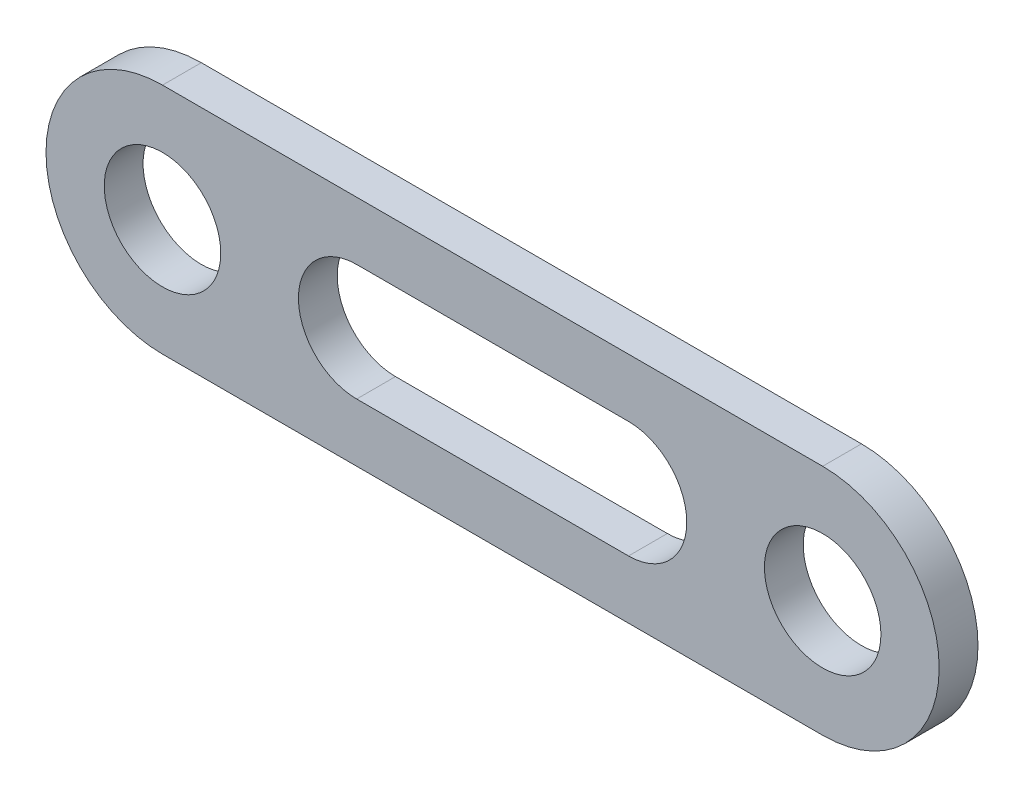
ISO-10303-21;
HEADER;
FILE_DESCRIPTION(('STEP AP214'),'2;1');
FILE_NAME('part.step','',(''),(''),'','','');
FILE_SCHEMA(('AUTOMOTIVE_DESIGN { 1 0 10303 214 1 1 1 1 }'));
ENDSEC;
DATA;
#1=APPLICATION_CONTEXT('core data for automotive mechanical design processes');
#2=APPLICATION_PROTOCOL_DEFINITION('international standard','automotive_design',2000,#1);
#3=PRODUCT_CONTEXT('',#1,'mechanical');
#4=PRODUCT('Part','Part','',(#3));
#5=PRODUCT_RELATED_PRODUCT_CATEGORY('part','',(#4));
#6=PRODUCT_DEFINITION_FORMATION('','',#4);
#7=PRODUCT_DEFINITION_CONTEXT('part definition',#1,'design');
#8=PRODUCT_DEFINITION('design','',#6,#7);
#9=PRODUCT_DEFINITION_SHAPE('','',#8);
#10=(LENGTH_UNIT() NAMED_UNIT(*) SI_UNIT(.MILLI.,.METRE.));
#11=(NAMED_UNIT(*) PLANE_ANGLE_UNIT() SI_UNIT($,.RADIAN.));
#12=(NAMED_UNIT(*) SI_UNIT($,.STERADIAN.) SOLID_ANGLE_UNIT());
#13=UNCERTAINTY_MEASURE_WITH_UNIT(LENGTH_MEASURE(1.E-05),#10,'distance_accuracy_value','');
#14=(GEOMETRIC_REPRESENTATION_CONTEXT(3) GLOBAL_UNCERTAINTY_ASSIGNED_CONTEXT((#13)) GLOBAL_UNIT_ASSIGNED_CONTEXT((#10,
#11,#12)) REPRESENTATION_CONTEXT('',''));
#15=CARTESIAN_POINT('',(0.,0.,0.));
#16=DIRECTION('',(0.,0.,1.));
#17=DIRECTION('',(1.,0.,0.));
#18=AXIS2_PLACEMENT_3D('',#15,#16,#17);
#19=CARTESIAN_POINT('',(0.,0.,2.));
#20=DIRECTION('',(0.,0.,1.));
#21=DIRECTION('',(1.,0.,0.));
#22=AXIS2_PLACEMENT_3D('',#19,#20,#21);
#23=PLANE('',#22);
#24=CARTESIAN_POINT('',(0.,0.,2.));
#25=DIRECTION('',(0.,0.,1.));
#26=DIRECTION('',(1.,0.,0.));
#27=AXIS2_PLACEMENT_3D('',#24,#25,#26);
#28=CIRCLE('',#27,3.);
#29=CARTESIAN_POINT('',(3.,0.,2.));
#30=VERTEX_POINT('',#29);
#31=EDGE_CURVE('E139',#30,#30,#28,.T.);
#32=ORIENTED_EDGE('',*,*,#31,.F.);
#33=EDGE_LOOP('',(#32));
#34=FACE_BOUND('',#33,.T.);
#35=CARTESIAN_POINT('',(0.,0.,2.));
#36=DIRECTION('',(0.,0.,1.));
#37=DIRECTION('',(1.,0.,0.));
#38=AXIS2_PLACEMENT_3D('',#35,#36,#37);
#39=CIRCLE('',#38,6.);
#40=CARTESIAN_POINT('',(0.,6.,2.));
#41=VERTEX_POINT('',#40);
#42=CARTESIAN_POINT('',(0.,-6.,2.));
#43=VERTEX_POINT('',#42);
#44=EDGE_CURVE('E145',#41,#43,#39,.T.);
#45=ORIENTED_EDGE('',*,*,#44,.T.);
#46=DIRECTION('',(1.,0.,0.));
#47=VECTOR('',#46,1.);
#48=CARTESIAN_POINT('',(0.,-6.,2.));
#49=LINE('',#48,#47);
#50=CARTESIAN_POINT('',(34.,-6.,2.));
#51=VERTEX_POINT('',#50);
#52=EDGE_CURVE('E148',#43,#51,#49,.T.);
#53=ORIENTED_EDGE('',*,*,#52,.T.);
#54=CARTESIAN_POINT('',(34.,0.,2.));
#55=DIRECTION('',(0.,0.,1.));
#56=DIRECTION('',(1.,0.,0.));
#57=AXIS2_PLACEMENT_3D('',#54,#55,#56);
#58=CIRCLE('',#57,6.);
#59=CARTESIAN_POINT('',(34.,6.,2.));
#60=VERTEX_POINT('',#59);
#61=EDGE_CURVE('E151',#51,#60,#58,.T.);
#62=ORIENTED_EDGE('',*,*,#61,.T.);
#63=DIRECTION('',(-1.,0.,0.));
#64=VECTOR('',#63,1.);
#65=CARTESIAN_POINT('',(0.,6.,2.));
#66=LINE('',#65,#64);
#67=EDGE_CURVE('E153',#60,#41,#66,.T.);
#68=ORIENTED_EDGE('',*,*,#67,.T.);
#69=EDGE_LOOP('',(#45,#53,#62,#68));
#70=FACE_BOUND('',#69,.T.);
#71=CARTESIAN_POINT('',(34.,0.,2.));
#72=DIRECTION('',(0.,0.,1.));
#73=DIRECTION('',(1.,0.,0.));
#74=AXIS2_PLACEMENT_3D('',#71,#72,#73);
#75=CIRCLE('',#74,2.99999999999999);
#76=CARTESIAN_POINT('',(37.,0.,2.));
#77=VERTEX_POINT('',#76);
#78=EDGE_CURVE('E133',#77,#77,#75,.T.);
#79=ORIENTED_EDGE('',*,*,#78,.F.);
#80=EDGE_LOOP('',(#79));
#81=FACE_BOUND('',#80,.T.);
#82=DIRECTION('',(1.,0.,0.));
#83=VECTOR('',#82,1.);
#84=CARTESIAN_POINT('',(10.,-3.,2.));
#85=LINE('',#84,#83);
#86=CARTESIAN_POINT('',(10.,-3.,2.));
#87=VERTEX_POINT('',#86);
#88=CARTESIAN_POINT('',(24.,-3.,2.));
#89=VERTEX_POINT('',#88);
#90=EDGE_CURVE('E105',#87,#89,#85,.T.);
#91=ORIENTED_EDGE('',*,*,#90,.F.);
#92=CARTESIAN_POINT('',(10.,0.,2.));
#93=DIRECTION('',(0.,0.,1.));
#94=DIRECTION('',(1.,0.,0.));
#95=AXIS2_PLACEMENT_3D('',#92,#93,#94);
#96=CIRCLE('',#95,3.);
#97=CARTESIAN_POINT('',(10.,3.,2.));
#98=VERTEX_POINT('',#97);
#99=EDGE_CURVE('E97',#98,#87,#96,.T.);
#100=ORIENTED_EDGE('',*,*,#99,.F.);
#101=DIRECTION('',(-1.,0.,0.));
#102=VECTOR('',#101,1.);
#103=CARTESIAN_POINT('',(10.,3.,2.));
#104=LINE('',#103,#102);
#105=CARTESIAN_POINT('',(24.,3.,2.));
#106=VERTEX_POINT('',#105);
#107=EDGE_CURVE('E119',#106,#98,#104,.T.);
#108=ORIENTED_EDGE('',*,*,#107,.F.);
#109=CARTESIAN_POINT('',(24.,0.,2.));
#110=DIRECTION('',(0.,0.,1.));
#111=DIRECTION('',(1.,0.,0.));
#112=AXIS2_PLACEMENT_3D('',#109,#110,#111);
#113=CIRCLE('',#112,3.);
#114=EDGE_CURVE('E117',#89,#106,#113,.T.);
#115=ORIENTED_EDGE('',*,*,#114,.F.);
#116=EDGE_LOOP('',(#91,#100,#108,#115));
#117=FACE_BOUND('',#116,.T.);
#118=ADVANCED_FACE('F32',(#34,#70,#81,#117),#23,.T.);
#119=CARTESIAN_POINT('',(0.,0.,0.));
#120=DIRECTION('',(0.,0.,1.));
#121=DIRECTION('',(1.,0.,0.));
#122=AXIS2_PLACEMENT_3D('',#119,#120,#121);
#123=PLANE('',#122);
#124=CARTESIAN_POINT('',(34.,0.,0.));
#125=DIRECTION('',(0.,0.,1.));
#126=DIRECTION('',(1.,0.,0.));
#127=AXIS2_PLACEMENT_3D('',#124,#125,#126);
#128=CIRCLE('',#127,2.99999999999999);
#129=CARTESIAN_POINT('',(37.,0.,0.));
#130=VERTEX_POINT('',#129);
#131=EDGE_CURVE('E113',#130,#130,#128,.T.);
#132=ORIENTED_EDGE('',*,*,#131,.T.);
#133=EDGE_LOOP('',(#132));
#134=FACE_BOUND('',#133,.T.);
#135=CARTESIAN_POINT('',(0.,0.,0.));
#136=DIRECTION('',(0.,0.,1.));
#137=DIRECTION('',(1.,0.,0.));
#138=AXIS2_PLACEMENT_3D('',#135,#136,#137);
#139=CIRCLE('',#138,3.);
#140=CARTESIAN_POINT('',(3.,0.,0.));
#141=VERTEX_POINT('',#140);
#142=EDGE_CURVE('E136',#141,#141,#139,.T.);
#143=ORIENTED_EDGE('',*,*,#142,.T.);
#144=EDGE_LOOP('',(#143));
#145=FACE_BOUND('',#144,.T.);
#146=CARTESIAN_POINT('',(0.,0.,0.));
#147=DIRECTION('',(0.,0.,1.));
#148=DIRECTION('',(1.,0.,0.));
#149=AXIS2_PLACEMENT_3D('',#146,#147,#148);
#150=CIRCLE('',#149,6.);
#151=CARTESIAN_POINT('',(0.,6.,0.));
#152=VERTEX_POINT('',#151);
#153=CARTESIAN_POINT('',(0.,-6.,0.));
#154=VERTEX_POINT('',#153);
#155=EDGE_CURVE('E142',#152,#154,#150,.T.);
#156=ORIENTED_EDGE('',*,*,#155,.F.);
#157=DIRECTION('',(-1.,0.,0.));
#158=VECTOR('',#157,1.);
#159=CARTESIAN_POINT('',(0.,6.,0.));
#160=LINE('',#159,#158);
#161=CARTESIAN_POINT('',(34.,6.,0.));
#162=VERTEX_POINT('',#161);
#163=EDGE_CURVE('E149',#162,#152,#160,.T.);
#164=ORIENTED_EDGE('',*,*,#163,.F.);
#165=CARTESIAN_POINT('',(34.,0.,0.));
#166=DIRECTION('',(0.,0.,1.));
#167=DIRECTION('',(1.,0.,0.));
#168=AXIS2_PLACEMENT_3D('',#165,#166,#167);
#169=CIRCLE('',#168,6.);
#170=CARTESIAN_POINT('',(34.,-6.,0.));
#171=VERTEX_POINT('',#170);
#172=EDGE_CURVE('E160',#171,#162,#169,.T.);
#173=ORIENTED_EDGE('',*,*,#172,.F.);
#174=DIRECTION('',(1.,0.,0.));
#175=VECTOR('',#174,1.);
#176=CARTESIAN_POINT('',(0.,-6.,0.));
#177=LINE('',#176,#175);
#178=EDGE_CURVE('E158',#154,#171,#177,.T.);
#179=ORIENTED_EDGE('',*,*,#178,.F.);
#180=EDGE_LOOP('',(#156,#164,#173,#179));
#181=FACE_BOUND('',#180,.T.);
#182=CARTESIAN_POINT('',(10.,0.,0.));
#183=DIRECTION('',(0.,0.,1.));
#184=DIRECTION('',(1.,0.,0.));
#185=AXIS2_PLACEMENT_3D('',#182,#183,#184);
#186=CIRCLE('',#185,3.);
#187=CARTESIAN_POINT('',(10.,3.,0.));
#188=VERTEX_POINT('',#187);
#189=CARTESIAN_POINT('',(10.,-3.,0.));
#190=VERTEX_POINT('',#189);
#191=EDGE_CURVE('E55',#188,#190,#186,.T.);
#192=ORIENTED_EDGE('',*,*,#191,.T.);
#193=DIRECTION('',(1.,0.,0.));
#194=VECTOR('',#193,1.);
#195=CARTESIAN_POINT('',(10.,-3.,0.));
#196=LINE('',#195,#194);
#197=CARTESIAN_POINT('',(24.,-3.,0.));
#198=VERTEX_POINT('',#197);
#199=EDGE_CURVE('E112',#190,#198,#196,.T.);
#200=ORIENTED_EDGE('',*,*,#199,.T.);
#201=CARTESIAN_POINT('',(24.,0.,0.));
#202=DIRECTION('',(0.,0.,1.));
#203=DIRECTION('',(1.,0.,0.));
#204=AXIS2_PLACEMENT_3D('',#201,#202,#203);
#205=CIRCLE('',#204,3.);
#206=CARTESIAN_POINT('',(24.,3.,0.));
#207=VERTEX_POINT('',#206);
#208=EDGE_CURVE('E125',#198,#207,#205,.T.);
#209=ORIENTED_EDGE('',*,*,#208,.T.);
#210=DIRECTION('',(-1.,0.,0.));
#211=VECTOR('',#210,1.);
#212=CARTESIAN_POINT('',(10.,3.,0.));
#213=LINE('',#212,#211);
#214=EDGE_CURVE('E106',#207,#188,#213,.T.);
#215=ORIENTED_EDGE('',*,*,#214,.T.);
#216=EDGE_LOOP('',(#192,#200,#209,#215));
#217=FACE_BOUND('',#216,.T.);
#218=ADVANCED_FACE('F178',(#134,#145,#181,#217),#123,.F.);
#219=CARTESIAN_POINT('',(0.,0.,2.));
#220=DIRECTION('',(0.,0.,-1.));
#221=DIRECTION('',(-1.,0.,0.));
#222=AXIS2_PLACEMENT_3D('',#219,#220,#221);
#223=CYLINDRICAL_SURFACE('',#222,6.);
#224=ORIENTED_EDGE('',*,*,#155,.T.);
#225=DIRECTION('',(0.,0.,-1.));
#226=VECTOR('',#225,1.);
#227=CARTESIAN_POINT('',(0.,-6.,2.));
#228=LINE('',#227,#226);
#229=EDGE_CURVE('E11',#43,#154,#228,.T.);
#230=ORIENTED_EDGE('',*,*,#229,.F.);
#231=ORIENTED_EDGE('',*,*,#44,.F.);
#232=DIRECTION('',(0.,0.,-1.));
#233=VECTOR('',#232,1.);
#234=CARTESIAN_POINT('',(0.,6.,2.));
#235=LINE('',#234,#233);
#236=EDGE_CURVE('E155',#41,#152,#235,.T.);
#237=ORIENTED_EDGE('',*,*,#236,.T.);
#238=EDGE_LOOP('',(#224,#230,#231,#237));
#239=FACE_BOUND('',#238,.T.);
#240=ADVANCED_FACE('F34',(#239),#223,.T.);
#241=CARTESIAN_POINT('',(0.,-6.,2.));
#242=DIRECTION('',(0.,1.,0.));
#243=DIRECTION('',(-1.,0.,0.));
#244=AXIS2_PLACEMENT_3D('',#241,#242,#243);
#245=PLANE('',#244);
#246=ORIENTED_EDGE('',*,*,#178,.T.);
#247=DIRECTION('',(0.,0.,-1.));
#248=VECTOR('',#247,1.);
#249=CARTESIAN_POINT('',(34.,-6.,2.));
#250=LINE('',#249,#248);
#251=EDGE_CURVE('E40',#51,#171,#250,.T.);
#252=ORIENTED_EDGE('',*,*,#251,.F.);
#253=ORIENTED_EDGE('',*,*,#52,.F.);
#254=ORIENTED_EDGE('',*,*,#229,.T.);
#255=EDGE_LOOP('',(#246,#252,#253,#254));
#256=FACE_BOUND('',#255,.T.);
#257=ADVANCED_FACE('F189',(#256),#245,.F.);
#258=CARTESIAN_POINT('',(34.,0.,2.));
#259=DIRECTION('',(0.,0.,-1.));
#260=DIRECTION('',(-1.,0.,0.));
#261=AXIS2_PLACEMENT_3D('',#258,#259,#260);
#262=CYLINDRICAL_SURFACE('',#261,6.);
#263=ORIENTED_EDGE('',*,*,#172,.T.);
#264=DIRECTION('',(0.,0.,-1.));
#265=VECTOR('',#264,1.);
#266=CARTESIAN_POINT('',(34.,6.,2.));
#267=LINE('',#266,#265);
#268=EDGE_CURVE('E165',#60,#162,#267,.T.);
#269=ORIENTED_EDGE('',*,*,#268,.F.);
#270=ORIENTED_EDGE('',*,*,#61,.F.);
#271=ORIENTED_EDGE('',*,*,#251,.T.);
#272=EDGE_LOOP('',(#263,#269,#270,#271));
#273=FACE_BOUND('',#272,.T.);
#274=ADVANCED_FACE('F172',(#273),#262,.T.);
#275=CARTESIAN_POINT('',(0.,6.,2.));
#276=DIRECTION('',(0.,-1.,0.));
#277=DIRECTION('',(1.,0.,0.));
#278=AXIS2_PLACEMENT_3D('',#275,#276,#277);
#279=PLANE('',#278);
#280=ORIENTED_EDGE('',*,*,#163,.T.);
#281=ORIENTED_EDGE('',*,*,#236,.F.);
#282=ORIENTED_EDGE('',*,*,#67,.F.);
#283=ORIENTED_EDGE('',*,*,#268,.T.);
#284=EDGE_LOOP('',(#280,#281,#282,#283));
#285=FACE_BOUND('',#284,.T.);
#286=ADVANCED_FACE('F182',(#285),#279,.F.);
#287=CARTESIAN_POINT('',(0.,0.,2.));
#288=DIRECTION('',(0.,0.,-1.));
#289=DIRECTION('',(-1.,0.,0.));
#290=AXIS2_PLACEMENT_3D('',#287,#288,#289);
#291=CYLINDRICAL_SURFACE('',#290,3.);
#292=ORIENTED_EDGE('',*,*,#31,.T.);
#293=EDGE_LOOP('',(#292));
#294=FACE_BOUND('',#293,.T.);
#295=ORIENTED_EDGE('',*,*,#142,.F.);
#296=EDGE_LOOP('',(#295));
#297=FACE_BOUND('',#296,.T.);
#298=ADVANCED_FACE('F206',(#294,#297),#291,.F.);
#299=CARTESIAN_POINT('',(34.,0.,2.));
#300=DIRECTION('',(0.,0.,-1.));
#301=DIRECTION('',(-1.,0.,0.));
#302=AXIS2_PLACEMENT_3D('',#299,#300,#301);
#303=CYLINDRICAL_SURFACE('',#302,2.99999999999999);
#304=ORIENTED_EDGE('',*,*,#78,.T.);
#305=EDGE_LOOP('',(#304));
#306=FACE_BOUND('',#305,.T.);
#307=ORIENTED_EDGE('',*,*,#131,.F.);
#308=EDGE_LOOP('',(#307));
#309=FACE_BOUND('',#308,.T.);
#310=ADVANCED_FACE('F213',(#306,#309),#303,.F.);
#311=CARTESIAN_POINT('',(10.,0.,2.));
#312=DIRECTION('',(0.,0.,-1.));
#313=DIRECTION('',(-1.,0.,0.));
#314=AXIS2_PLACEMENT_3D('',#311,#312,#313);
#315=CYLINDRICAL_SURFACE('',#314,3.);
#316=ORIENTED_EDGE('',*,*,#191,.F.);
#317=DIRECTION('',(0.,0.,-1.));
#318=VECTOR('',#317,1.);
#319=CARTESIAN_POINT('',(10.,3.,2.));
#320=LINE('',#319,#318);
#321=EDGE_CURVE('E101',#98,#188,#320,.T.);
#322=ORIENTED_EDGE('',*,*,#321,.F.);
#323=ORIENTED_EDGE('',*,*,#99,.T.);
#324=DIRECTION('',(0.,0.,-1.));
#325=VECTOR('',#324,1.);
#326=CARTESIAN_POINT('',(10.,-3.,2.));
#327=LINE('',#326,#325);
#328=EDGE_CURVE('E100',#87,#190,#327,.T.);
#329=ORIENTED_EDGE('',*,*,#328,.T.);
#330=EDGE_LOOP('',(#316,#322,#323,#329));
#331=FACE_BOUND('',#330,.T.);
#332=ADVANCED_FACE('F99',(#331),#315,.F.);
#333=CARTESIAN_POINT('',(10.,-3.,2.));
#334=DIRECTION('',(0.,1.,0.));
#335=DIRECTION('',(-1.,0.,0.));
#336=AXIS2_PLACEMENT_3D('',#333,#334,#335);
#337=PLANE('',#336);
#338=ORIENTED_EDGE('',*,*,#199,.F.);
#339=ORIENTED_EDGE('',*,*,#328,.F.);
#340=ORIENTED_EDGE('',*,*,#90,.T.);
#341=DIRECTION('',(0.,0.,-1.));
#342=VECTOR('',#341,1.);
#343=CARTESIAN_POINT('',(24.,-3.,2.));
#344=LINE('',#343,#342);
#345=EDGE_CURVE('E114',#89,#198,#344,.T.);
#346=ORIENTED_EDGE('',*,*,#345,.T.);
#347=EDGE_LOOP('',(#338,#339,#340,#346));
#348=FACE_BOUND('',#347,.T.);
#349=ADVANCED_FACE('F109',(#348),#337,.T.);
#350=CARTESIAN_POINT('',(24.,0.,2.));
#351=DIRECTION('',(0.,0.,-1.));
#352=DIRECTION('',(-1.,0.,0.));
#353=AXIS2_PLACEMENT_3D('',#350,#351,#352);
#354=CYLINDRICAL_SURFACE('',#353,3.);
#355=ORIENTED_EDGE('',*,*,#208,.F.);
#356=ORIENTED_EDGE('',*,*,#345,.F.);
#357=ORIENTED_EDGE('',*,*,#114,.T.);
#358=DIRECTION('',(0.,0.,-1.));
#359=VECTOR('',#358,1.);
#360=CARTESIAN_POINT('',(24.,3.,2.));
#361=LINE('',#360,#359);
#362=EDGE_CURVE('E47',#106,#207,#361,.T.);
#363=ORIENTED_EDGE('',*,*,#362,.T.);
#364=EDGE_LOOP('',(#355,#356,#357,#363));
#365=FACE_BOUND('',#364,.T.);
#366=ADVANCED_FACE('F230',(#365),#354,.F.);
#367=CARTESIAN_POINT('',(10.,3.,2.));
#368=DIRECTION('',(0.,-1.,0.));
#369=DIRECTION('',(1.,0.,0.));
#370=AXIS2_PLACEMENT_3D('',#367,#368,#369);
#371=PLANE('',#370);
#372=ORIENTED_EDGE('',*,*,#214,.F.);
#373=ORIENTED_EDGE('',*,*,#362,.F.);
#374=ORIENTED_EDGE('',*,*,#107,.T.);
#375=ORIENTED_EDGE('',*,*,#321,.T.);
#376=EDGE_LOOP('',(#372,#373,#374,#375));
#377=FACE_BOUND('',#376,.T.);
#378=ADVANCED_FACE('F233',(#377),#371,.T.);
#379=CLOSED_SHELL('',(#118,#218,#240,#257,#274,#286,#298,#310,#332,#349,#366,#378));
#380=MANIFOLD_SOLID_BREP('B2',#379);
#381=ADVANCED_BREP_SHAPE_REPRESENTATION('',(#18,#380),#14);
#382=SHAPE_DEFINITION_REPRESENTATION(#9,#381);
ENDSEC;
END-ISO-10303-21;
